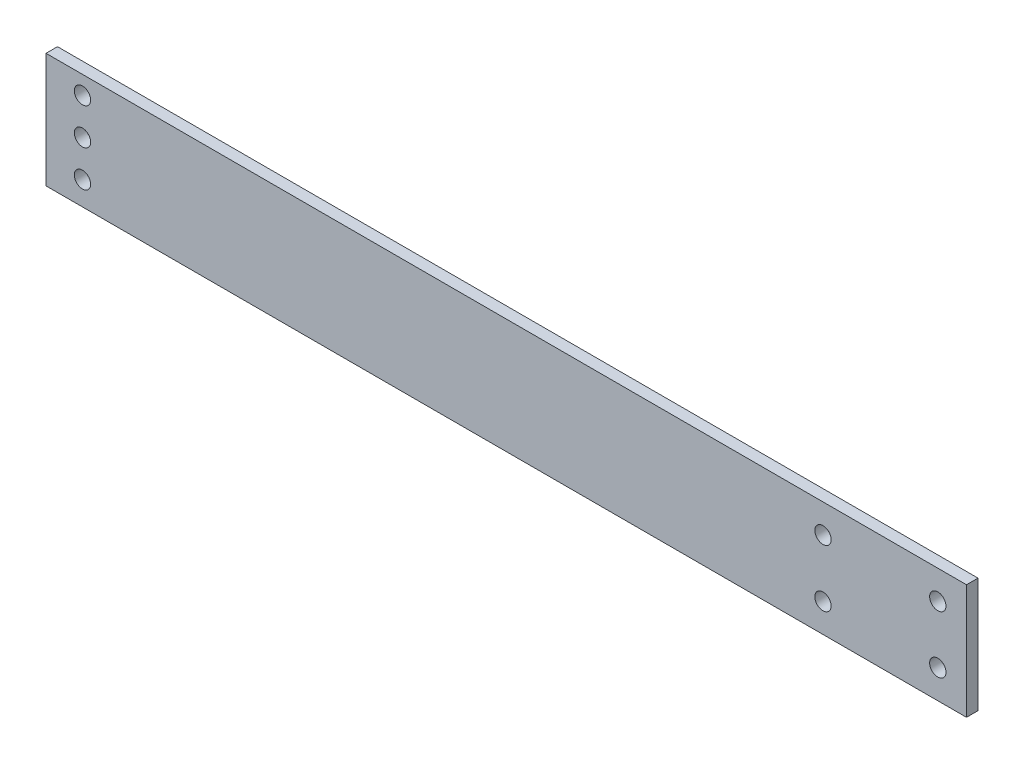
ISO-10303-21;
HEADER;
FILE_DESCRIPTION(('STEP AP214'),'2;1');
FILE_NAME('part.step','',(''),(''),'','','');
FILE_SCHEMA(('AUTOMOTIVE_DESIGN { 1 0 10303 214 1 1 1 1 }'));
ENDSEC;
DATA;
#1=APPLICATION_CONTEXT('core data for automotive mechanical design processes');
#2=APPLICATION_PROTOCOL_DEFINITION('international standard','automotive_design',2000,#1);
#3=PRODUCT_CONTEXT('',#1,'mechanical');
#4=PRODUCT('Part','Part','',(#3));
#5=PRODUCT_RELATED_PRODUCT_CATEGORY('part','',(#4));
#6=PRODUCT_DEFINITION_FORMATION('','',#4);
#7=PRODUCT_DEFINITION_CONTEXT('part definition',#1,'design');
#8=PRODUCT_DEFINITION('design','',#6,#7);
#9=PRODUCT_DEFINITION_SHAPE('','',#8);
#10=(LENGTH_UNIT() NAMED_UNIT(*) SI_UNIT(.MILLI.,.METRE.));
#11=(NAMED_UNIT(*) PLANE_ANGLE_UNIT() SI_UNIT($,.RADIAN.));
#12=(NAMED_UNIT(*) SI_UNIT($,.STERADIAN.) SOLID_ANGLE_UNIT());
#13=UNCERTAINTY_MEASURE_WITH_UNIT(LENGTH_MEASURE(1.E-05),#10,'distance_accuracy_value','');
#14=(GEOMETRIC_REPRESENTATION_CONTEXT(3) GLOBAL_UNCERTAINTY_ASSIGNED_CONTEXT((#13)) GLOBAL_UNIT_ASSIGNED_CONTEXT((#10,
#11,#12)) REPRESENTATION_CONTEXT('',''));
#15=CARTESIAN_POINT('',(0.,0.,0.));
#16=DIRECTION('',(0.,0.,1.));
#17=DIRECTION('',(1.,0.,0.));
#18=AXIS2_PLACEMENT_3D('',#15,#16,#17);
#19=CARTESIAN_POINT('',(80.155,-10.,2.));
#20=DIRECTION('',(-1.,0.,0.));
#21=DIRECTION('',(0.,0.,1.));
#22=AXIS2_PLACEMENT_3D('',#19,#20,#21);
#23=PLANE('',#22);
#24=DIRECTION('',(0.,1.,0.));
#25=VECTOR('',#24,1.);
#26=CARTESIAN_POINT('',(80.155,-10.,0.));
#27=LINE('',#26,#25);
#28=CARTESIAN_POINT('',(80.155,-10.,0.));
#29=VERTEX_POINT('',#28);
#30=CARTESIAN_POINT('',(80.155,10.,0.));
#31=VERTEX_POINT('',#30);
#32=EDGE_CURVE('E96',#29,#31,#27,.T.);
#33=ORIENTED_EDGE('',*,*,#32,.T.);
#34=DIRECTION('',(0.,0.,-1.));
#35=VECTOR('',#34,1.);
#36=CARTESIAN_POINT('',(80.155,10.,2.));
#37=LINE('',#36,#35);
#38=CARTESIAN_POINT('',(80.155,10.,2.));
#39=VERTEX_POINT('',#38);
#40=EDGE_CURVE('E11',#39,#31,#37,.T.);
#41=ORIENTED_EDGE('',*,*,#40,.F.);
#42=DIRECTION('',(0.,1.,0.));
#43=VECTOR('',#42,1.);
#44=CARTESIAN_POINT('',(80.155,-10.,2.));
#45=LINE('',#44,#43);
#46=CARTESIAN_POINT('',(80.155,-10.,2.));
#47=VERTEX_POINT('',#46);
#48=EDGE_CURVE('E84',#47,#39,#45,.T.);
#49=ORIENTED_EDGE('',*,*,#48,.F.);
#50=DIRECTION('',(0.,0.,-1.));
#51=VECTOR('',#50,1.);
#52=CARTESIAN_POINT('',(80.155,-10.,2.));
#53=LINE('',#52,#51);
#54=EDGE_CURVE('E92',#47,#29,#53,.T.);
#55=ORIENTED_EDGE('',*,*,#54,.T.);
#56=EDGE_LOOP('',(#33,#41,#49,#55));
#57=FACE_BOUND('',#56,.T.);
#58=ADVANCED_FACE('F33',(#57),#23,.F.);
#59=CARTESIAN_POINT('',(-80.155,10.,2.));
#60=DIRECTION('',(0.,-1.,0.));
#61=DIRECTION('',(0.,0.,-1.));
#62=AXIS2_PLACEMENT_3D('',#59,#60,#61);
#63=PLANE('',#62);
#64=DIRECTION('',(-1.,0.,0.));
#65=VECTOR('',#64,1.);
#66=CARTESIAN_POINT('',(-80.155,10.,0.));
#67=LINE('',#66,#65);
#68=CARTESIAN_POINT('',(-80.155,10.,0.));
#69=VERTEX_POINT('',#68);
#70=EDGE_CURVE('E88',#31,#69,#67,.T.);
#71=ORIENTED_EDGE('',*,*,#70,.T.);
#72=DIRECTION('',(0.,0.,-1.));
#73=VECTOR('',#72,1.);
#74=CARTESIAN_POINT('',(-80.155,10.,2.));
#75=LINE('',#74,#73);
#76=CARTESIAN_POINT('',(-80.155,10.,2.));
#77=VERTEX_POINT('',#76);
#78=EDGE_CURVE('E41',#77,#69,#75,.T.);
#79=ORIENTED_EDGE('',*,*,#78,.F.);
#80=DIRECTION('',(-1.,0.,0.));
#81=VECTOR('',#80,1.);
#82=CARTESIAN_POINT('',(-80.155,10.,2.));
#83=LINE('',#82,#81);
#84=EDGE_CURVE('E79',#39,#77,#83,.T.);
#85=ORIENTED_EDGE('',*,*,#84,.F.);
#86=ORIENTED_EDGE('',*,*,#40,.T.);
#87=EDGE_LOOP('',(#71,#79,#85,#86));
#88=FACE_BOUND('',#87,.T.);
#89=ADVANCED_FACE('F87',(#88),#63,.F.);
#90=CARTESIAN_POINT('',(-80.155,-10.,2.));
#91=DIRECTION('',(1.,0.,0.));
#92=DIRECTION('',(0.,0.,-1.));
#93=AXIS2_PLACEMENT_3D('',#90,#91,#92);
#94=PLANE('',#93);
#95=DIRECTION('',(0.,-1.,0.));
#96=VECTOR('',#95,1.);
#97=CARTESIAN_POINT('',(-80.155,-10.,0.));
#98=LINE('',#97,#96);
#99=CARTESIAN_POINT('',(-80.155,-10.,0.));
#100=VERTEX_POINT('',#99);
#101=EDGE_CURVE('E66',#69,#100,#98,.T.);
#102=ORIENTED_EDGE('',*,*,#101,.T.);
#103=DIRECTION('',(0.,0.,-1.));
#104=VECTOR('',#103,1.);
#105=CARTESIAN_POINT('',(-80.155,-10.,2.));
#106=LINE('',#105,#104);
#107=CARTESIAN_POINT('',(-80.155,-10.,2.));
#108=VERTEX_POINT('',#107);
#109=EDGE_CURVE('E89',#108,#100,#106,.T.);
#110=ORIENTED_EDGE('',*,*,#109,.F.);
#111=DIRECTION('',(0.,-1.,0.));
#112=VECTOR('',#111,1.);
#113=CARTESIAN_POINT('',(-80.155,-10.,2.));
#114=LINE('',#113,#112);
#115=EDGE_CURVE('E82',#77,#108,#114,.T.);
#116=ORIENTED_EDGE('',*,*,#115,.F.);
#117=ORIENTED_EDGE('',*,*,#78,.T.);
#118=EDGE_LOOP('',(#102,#110,#116,#117));
#119=FACE_BOUND('',#118,.T.);
#120=ADVANCED_FACE('F90',(#119),#94,.F.);
#121=CARTESIAN_POINT('',(-80.155,-10.,2.));
#122=DIRECTION('',(0.,1.,0.));
#123=DIRECTION('',(0.,0.,1.));
#124=AXIS2_PLACEMENT_3D('',#121,#122,#123);
#125=PLANE('',#124);
#126=DIRECTION('',(1.,0.,0.));
#127=VECTOR('',#126,1.);
#128=CARTESIAN_POINT('',(-80.155,-10.,0.));
#129=LINE('',#128,#127);
#130=EDGE_CURVE('E72',#100,#29,#129,.T.);
#131=ORIENTED_EDGE('',*,*,#130,.T.);
#132=ORIENTED_EDGE('',*,*,#54,.F.);
#133=DIRECTION('',(1.,0.,0.));
#134=VECTOR('',#133,1.);
#135=CARTESIAN_POINT('',(-80.155,-10.,2.));
#136=LINE('',#135,#134);
#137=EDGE_CURVE('E49',#108,#47,#136,.T.);
#138=ORIENTED_EDGE('',*,*,#137,.F.);
#139=ORIENTED_EDGE('',*,*,#109,.T.);
#140=EDGE_LOOP('',(#131,#132,#138,#139));
#141=FACE_BOUND('',#140,.T.);
#142=ADVANCED_FACE('F104',(#141),#125,.F.);
#143=CARTESIAN_POINT('',(0.,0.,2.));
#144=DIRECTION('',(0.,0.,-1.));
#145=DIRECTION('',(-1.,0.,0.));
#146=AXIS2_PLACEMENT_3D('',#143,#144,#145);
#147=PLANE('',#146);
#148=CARTESIAN_POINT('',(-73.8049999999999,0.475000000000001,2.));
#149=DIRECTION('',(0.,0.,1.));
#150=DIRECTION('',(1.,0.,0.));
#151=AXIS2_PLACEMENT_3D('',#148,#149,#150);
#152=CIRCLE('',#151,1.42240000000001);
#153=CARTESIAN_POINT('',(-72.3825999999999,0.475000000000001,2.));
#154=VERTEX_POINT('',#153);
#155=EDGE_CURVE('E113',#154,#154,#152,.T.);
#156=ORIENTED_EDGE('',*,*,#155,.F.);
#157=EDGE_LOOP('',(#156));
#158=FACE_BOUND('',#157,.T.);
#159=CARTESIAN_POINT('',(-73.8049999999999,-5.875,2.));
#160=DIRECTION('',(0.,0.,1.));
#161=DIRECTION('',(1.,0.,0.));
#162=AXIS2_PLACEMENT_3D('',#159,#160,#161);
#163=CIRCLE('',#162,1.42240000000001);
#164=CARTESIAN_POINT('',(-72.3825999999999,-5.875,2.));
#165=VERTEX_POINT('',#164);
#166=EDGE_CURVE('E132',#165,#165,#163,.T.);
#167=ORIENTED_EDGE('',*,*,#166,.F.);
#168=EDGE_LOOP('',(#167));
#169=FACE_BOUND('',#168,.T.);
#170=CARTESIAN_POINT('',(75.155,5.,2.));
#171=DIRECTION('',(0.,0.,1.));
#172=DIRECTION('',(1.,0.,0.));
#173=AXIS2_PLACEMENT_3D('',#170,#171,#172);
#174=CIRCLE('',#173,1.42240000000001);
#175=CARTESIAN_POINT('',(76.5774,5.,2.));
#176=VERTEX_POINT('',#175);
#177=EDGE_CURVE('E126',#176,#176,#174,.T.);
#178=ORIENTED_EDGE('',*,*,#177,.F.);
#179=EDGE_LOOP('',(#178));
#180=FACE_BOUND('',#179,.T.);
#181=CARTESIAN_POINT('',(55.155,4.99999999999986,2.));
#182=DIRECTION('',(0.,0.,1.));
#183=DIRECTION('',(1.,0.,0.));
#184=AXIS2_PLACEMENT_3D('',#181,#182,#183);
#185=CIRCLE('',#184,1.42240000000001);
#186=CARTESIAN_POINT('',(56.5774,4.99999999999986,2.));
#187=VERTEX_POINT('',#186);
#188=EDGE_CURVE('E119',#187,#187,#185,.T.);
#189=ORIENTED_EDGE('',*,*,#188,.F.);
#190=EDGE_LOOP('',(#189));
#191=FACE_BOUND('',#190,.T.);
#192=CARTESIAN_POINT('',(55.1550000000001,-5.00000000000014,2.));
#193=DIRECTION('',(0.,0.,1.));
#194=DIRECTION('',(1.,0.,0.));
#195=AXIS2_PLACEMENT_3D('',#192,#193,#194);
#196=CIRCLE('',#195,1.42240000000001);
#197=CARTESIAN_POINT('',(56.5774000000001,-5.00000000000014,2.));
#198=VERTEX_POINT('',#197);
#199=EDGE_CURVE('E120',#198,#198,#196,.T.);
#200=ORIENTED_EDGE('',*,*,#199,.F.);
#201=EDGE_LOOP('',(#200));
#202=FACE_BOUND('',#201,.T.);
#203=CARTESIAN_POINT('',(75.1550000000001,-5.,2.));
#204=DIRECTION('',(0.,0.,1.));
#205=DIRECTION('',(1.,0.,0.));
#206=AXIS2_PLACEMENT_3D('',#203,#204,#205);
#207=CIRCLE('',#206,1.42240000000001);
#208=CARTESIAN_POINT('',(76.5774000000001,-5.,2.));
#209=VERTEX_POINT('',#208);
#210=EDGE_CURVE('E143',#209,#209,#207,.T.);
#211=ORIENTED_EDGE('',*,*,#210,.F.);
#212=EDGE_LOOP('',(#211));
#213=FACE_BOUND('',#212,.T.);
#214=CARTESIAN_POINT('',(-73.805,6.825,2.));
#215=DIRECTION('',(0.,0.,1.));
#216=DIRECTION('',(1.,0.,0.));
#217=AXIS2_PLACEMENT_3D('',#214,#215,#216);
#218=CIRCLE('',#217,1.42240000000001);
#219=CARTESIAN_POINT('',(-72.3826,6.825,2.));
#220=VERTEX_POINT('',#219);
#221=EDGE_CURVE('E99',#220,#220,#218,.T.);
#222=ORIENTED_EDGE('',*,*,#221,.F.);
#223=EDGE_LOOP('',(#222));
#224=FACE_BOUND('',#223,.T.);
#225=ORIENTED_EDGE('',*,*,#48,.T.);
#226=ORIENTED_EDGE('',*,*,#84,.T.);
#227=ORIENTED_EDGE('',*,*,#115,.T.);
#228=ORIENTED_EDGE('',*,*,#137,.T.);
#229=EDGE_LOOP('',(#225,#226,#227,#228));
#230=FACE_BOUND('',#229,.T.);
#231=ADVANCED_FACE('F80',(#158,#169,#180,#191,#202,#213,#224,#230),#147,.F.);
#232=CARTESIAN_POINT('',(0.,0.,0.));
#233=DIRECTION('',(0.,0.,-1.));
#234=DIRECTION('',(-1.,0.,0.));
#235=AXIS2_PLACEMENT_3D('',#232,#233,#234);
#236=PLANE('',#235);
#237=CARTESIAN_POINT('',(-73.8049999999999,0.475000000000001,0.));
#238=DIRECTION('',(0.,0.,-1.));
#239=DIRECTION('',(-1.,0.,0.));
#240=AXIS2_PLACEMENT_3D('',#237,#238,#239);
#241=CIRCLE('',#240,1.42240000000001);
#242=CARTESIAN_POINT('',(-75.2273999999999,0.475000000000001,0.));
#243=VERTEX_POINT('',#242);
#244=EDGE_CURVE('E135',#243,#243,#241,.F.);
#245=ORIENTED_EDGE('',*,*,#244,.T.);
#246=EDGE_LOOP('',(#245));
#247=FACE_BOUND('',#246,.T.);
#248=CARTESIAN_POINT('',(-73.8049999999999,-5.875,0.));
#249=DIRECTION('',(0.,0.,-1.));
#250=DIRECTION('',(-1.,0.,0.));
#251=AXIS2_PLACEMENT_3D('',#248,#249,#250);
#252=CIRCLE('',#251,1.42240000000001);
#253=CARTESIAN_POINT('',(-75.2273999999999,-5.875,0.));
#254=VERTEX_POINT('',#253);
#255=EDGE_CURVE('E129',#254,#254,#252,.F.);
#256=ORIENTED_EDGE('',*,*,#255,.T.);
#257=EDGE_LOOP('',(#256));
#258=FACE_BOUND('',#257,.T.);
#259=CARTESIAN_POINT('',(75.155,5.,0.));
#260=DIRECTION('',(0.,0.,-1.));
#261=DIRECTION('',(-1.,0.,0.));
#262=AXIS2_PLACEMENT_3D('',#259,#260,#261);
#263=CIRCLE('',#262,1.42240000000001);
#264=CARTESIAN_POINT('',(73.7326,5.,0.));
#265=VERTEX_POINT('',#264);
#266=EDGE_CURVE('E123',#265,#265,#263,.F.);
#267=ORIENTED_EDGE('',*,*,#266,.T.);
#268=EDGE_LOOP('',(#267));
#269=FACE_BOUND('',#268,.T.);
#270=CARTESIAN_POINT('',(55.155,4.99999999999986,0.));
#271=DIRECTION('',(0.,0.,-1.));
#272=DIRECTION('',(-1.,0.,0.));
#273=AXIS2_PLACEMENT_3D('',#270,#271,#272);
#274=CIRCLE('',#273,1.42240000000001);
#275=CARTESIAN_POINT('',(53.7326,4.99999999999986,0.));
#276=VERTEX_POINT('',#275);
#277=EDGE_CURVE('E116',#276,#276,#274,.F.);
#278=ORIENTED_EDGE('',*,*,#277,.T.);
#279=EDGE_LOOP('',(#278));
#280=FACE_BOUND('',#279,.T.);
#281=CARTESIAN_POINT('',(55.1550000000001,-5.00000000000014,0.));
#282=DIRECTION('',(0.,0.,-1.));
#283=DIRECTION('',(-1.,0.,0.));
#284=AXIS2_PLACEMENT_3D('',#281,#282,#283);
#285=CIRCLE('',#284,1.42240000000001);
#286=CARTESIAN_POINT('',(53.7326000000001,-5.00000000000014,0.));
#287=VERTEX_POINT('',#286);
#288=EDGE_CURVE('E146',#287,#287,#285,.F.);
#289=ORIENTED_EDGE('',*,*,#288,.T.);
#290=EDGE_LOOP('',(#289));
#291=FACE_BOUND('',#290,.T.);
#292=CARTESIAN_POINT('',(75.1550000000001,-5.,0.));
#293=DIRECTION('',(0.,0.,-1.));
#294=DIRECTION('',(-1.,0.,0.));
#295=AXIS2_PLACEMENT_3D('',#292,#293,#294);
#296=CIRCLE('',#295,1.42240000000001);
#297=CARTESIAN_POINT('',(73.7326000000001,-5.,0.));
#298=VERTEX_POINT('',#297);
#299=EDGE_CURVE('E140',#298,#298,#296,.F.);
#300=ORIENTED_EDGE('',*,*,#299,.T.);
#301=EDGE_LOOP('',(#300));
#302=FACE_BOUND('',#301,.T.);
#303=CARTESIAN_POINT('',(-73.805,6.825,0.));
#304=DIRECTION('',(0.,0.,-1.));
#305=DIRECTION('',(-1.,0.,0.));
#306=AXIS2_PLACEMENT_3D('',#303,#304,#305);
#307=CIRCLE('',#306,1.42240000000001);
#308=CARTESIAN_POINT('',(-75.2274,6.825,0.));
#309=VERTEX_POINT('',#308);
#310=EDGE_CURVE('E110',#309,#309,#307,.F.);
#311=ORIENTED_EDGE('',*,*,#310,.T.);
#312=EDGE_LOOP('',(#311));
#313=FACE_BOUND('',#312,.T.);
#314=ORIENTED_EDGE('',*,*,#32,.F.);
#315=ORIENTED_EDGE('',*,*,#130,.F.);
#316=ORIENTED_EDGE('',*,*,#101,.F.);
#317=ORIENTED_EDGE('',*,*,#70,.F.);
#318=EDGE_LOOP('',(#314,#315,#316,#317));
#319=FACE_BOUND('',#318,.T.);
#320=ADVANCED_FACE('F107',(#247,#258,#269,#280,#291,#302,#313,#319),#236,.T.);
#321=CARTESIAN_POINT('',(-73.805,6.825,-0.00100000000000013));
#322=DIRECTION('',(0.,0.,1.));
#323=DIRECTION('',(1.,0.,0.));
#324=AXIS2_PLACEMENT_3D('',#321,#322,#323);
#325=CYLINDRICAL_SURFACE('',#324,1.42240000000001);
#326=ORIENTED_EDGE('',*,*,#310,.F.);
#327=EDGE_LOOP('',(#326));
#328=FACE_BOUND('',#327,.T.);
#329=ORIENTED_EDGE('',*,*,#221,.T.);
#330=EDGE_LOOP('',(#329));
#331=FACE_BOUND('',#330,.T.);
#332=ADVANCED_FACE('F162',(#328,#331),#325,.F.);
#333=CARTESIAN_POINT('',(75.1550000000001,-5.,-0.00100000000000013));
#334=DIRECTION('',(0.,0.,1.));
#335=DIRECTION('',(1.,0.,0.));
#336=AXIS2_PLACEMENT_3D('',#333,#334,#335);
#337=CYLINDRICAL_SURFACE('',#336,1.42240000000001);
#338=ORIENTED_EDGE('',*,*,#299,.F.);
#339=EDGE_LOOP('',(#338));
#340=FACE_BOUND('',#339,.T.);
#341=ORIENTED_EDGE('',*,*,#210,.T.);
#342=EDGE_LOOP('',(#341));
#343=FACE_BOUND('',#342,.T.);
#344=ADVANCED_FACE('F164',(#340,#343),#337,.F.);
#345=CARTESIAN_POINT('',(55.1550000000001,-5.00000000000014,-0.00100000000000013));
#346=DIRECTION('',(0.,0.,1.));
#347=DIRECTION('',(1.,0.,0.));
#348=AXIS2_PLACEMENT_3D('',#345,#346,#347);
#349=CYLINDRICAL_SURFACE('',#348,1.42240000000001);
#350=ORIENTED_EDGE('',*,*,#288,.F.);
#351=EDGE_LOOP('',(#350));
#352=FACE_BOUND('',#351,.T.);
#353=ORIENTED_EDGE('',*,*,#199,.T.);
#354=EDGE_LOOP('',(#353));
#355=FACE_BOUND('',#354,.T.);
#356=ADVANCED_FACE('F152',(#352,#355),#349,.F.);
#357=CARTESIAN_POINT('',(55.155,4.99999999999986,-0.00100000000000013));
#358=DIRECTION('',(0.,0.,1.));
#359=DIRECTION('',(1.,0.,0.));
#360=AXIS2_PLACEMENT_3D('',#357,#358,#359);
#361=CYLINDRICAL_SURFACE('',#360,1.42240000000001);
#362=ORIENTED_EDGE('',*,*,#277,.F.);
#363=EDGE_LOOP('',(#362));
#364=FACE_BOUND('',#363,.T.);
#365=ORIENTED_EDGE('',*,*,#188,.T.);
#366=EDGE_LOOP('',(#365));
#367=FACE_BOUND('',#366,.T.);
#368=ADVANCED_FACE('F218',(#364,#367),#361,.F.);
#369=CARTESIAN_POINT('',(75.155,5.,-0.00100000000000013));
#370=DIRECTION('',(0.,0.,1.));
#371=DIRECTION('',(1.,0.,0.));
#372=AXIS2_PLACEMENT_3D('',#369,#370,#371);
#373=CYLINDRICAL_SURFACE('',#372,1.42240000000001);
#374=ORIENTED_EDGE('',*,*,#266,.F.);
#375=EDGE_LOOP('',(#374));
#376=FACE_BOUND('',#375,.T.);
#377=ORIENTED_EDGE('',*,*,#177,.T.);
#378=EDGE_LOOP('',(#377));
#379=FACE_BOUND('',#378,.T.);
#380=ADVANCED_FACE('F228',(#376,#379),#373,.F.);
#381=CARTESIAN_POINT('',(-73.8049999999999,-5.875,-0.00100000000000013));
#382=DIRECTION('',(0.,0.,1.));
#383=DIRECTION('',(1.,0.,0.));
#384=AXIS2_PLACEMENT_3D('',#381,#382,#383);
#385=CYLINDRICAL_SURFACE('',#384,1.42240000000001);
#386=ORIENTED_EDGE('',*,*,#255,.F.);
#387=EDGE_LOOP('',(#386));
#388=FACE_BOUND('',#387,.T.);
#389=ORIENTED_EDGE('',*,*,#166,.T.);
#390=EDGE_LOOP('',(#389));
#391=FACE_BOUND('',#390,.T.);
#392=ADVANCED_FACE('F237',(#388,#391),#385,.F.);
#393=CARTESIAN_POINT('',(-73.8049999999999,0.475000000000001,-0.00100000000000013));
#394=DIRECTION('',(0.,0.,1.));
#395=DIRECTION('',(1.,0.,0.));
#396=AXIS2_PLACEMENT_3D('',#393,#394,#395);
#397=CYLINDRICAL_SURFACE('',#396,1.42240000000001);
#398=ORIENTED_EDGE('',*,*,#244,.F.);
#399=EDGE_LOOP('',(#398));
#400=FACE_BOUND('',#399,.T.);
#401=ORIENTED_EDGE('',*,*,#155,.T.);
#402=EDGE_LOOP('',(#401));
#403=FACE_BOUND('',#402,.T.);
#404=ADVANCED_FACE('F247',(#400,#403),#397,.F.);
#405=CLOSED_SHELL('',(#58,#89,#120,#142,#231,#320,#332,#344,#356,#368,#380,#392,#404));
#406=MANIFOLD_SOLID_BREP('B2',#405);
#407=ADVANCED_BREP_SHAPE_REPRESENTATION('',(#18,#406),#14);
#408=SHAPE_DEFINITION_REPRESENTATION(#9,#407);
ENDSEC;
END-ISO-10303-21;
